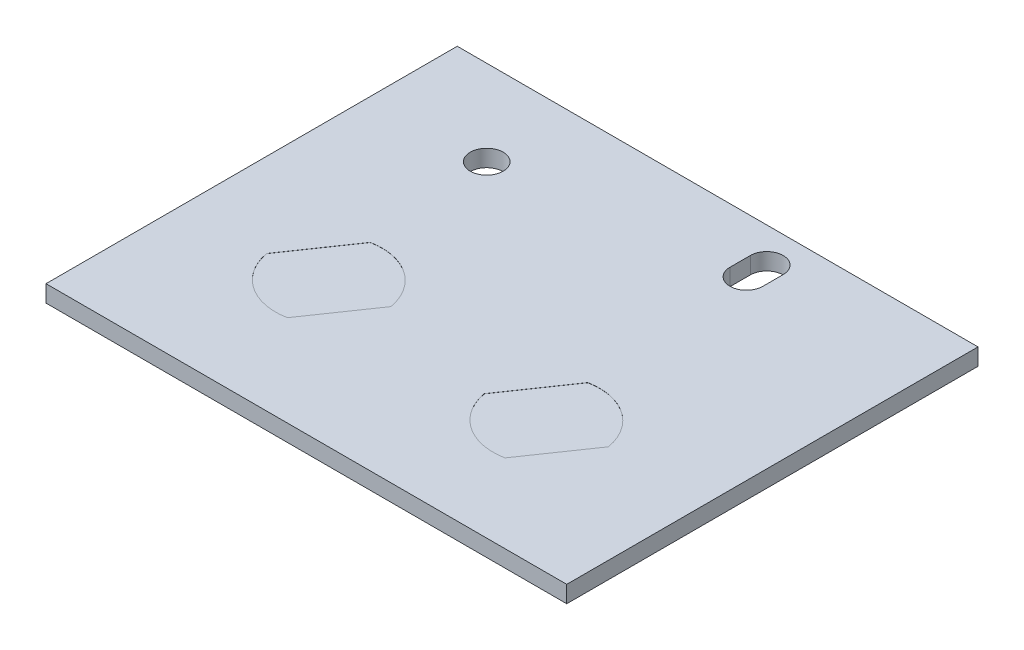
ISO-10303-21;
HEADER;
FILE_DESCRIPTION(('STEP AP214'),'2;1');
FILE_NAME('part.step','',(''),(''),'','','');
FILE_SCHEMA(('AUTOMOTIVE_DESIGN { 1 0 10303 214 1 1 1 1 }'));
ENDSEC;
DATA;
#1=APPLICATION_CONTEXT('core data for automotive mechanical design processes');
#2=APPLICATION_PROTOCOL_DEFINITION('international standard','automotive_design',2000,#1);
#3=PRODUCT_CONTEXT('',#1,'mechanical');
#4=PRODUCT('Part','Part','',(#3));
#5=PRODUCT_RELATED_PRODUCT_CATEGORY('part','',(#4));
#6=PRODUCT_DEFINITION_FORMATION('','',#4);
#7=PRODUCT_DEFINITION_CONTEXT('part definition',#1,'design');
#8=PRODUCT_DEFINITION('design','',#6,#7);
#9=PRODUCT_DEFINITION_SHAPE('','',#8);
#10=(LENGTH_UNIT() NAMED_UNIT(*) SI_UNIT(.MILLI.,.METRE.));
#11=(NAMED_UNIT(*) PLANE_ANGLE_UNIT() SI_UNIT($,.RADIAN.));
#12=(NAMED_UNIT(*) SI_UNIT($,.STERADIAN.) SOLID_ANGLE_UNIT());
#13=UNCERTAINTY_MEASURE_WITH_UNIT(LENGTH_MEASURE(1.E-05),#10,'distance_accuracy_value','');
#14=(GEOMETRIC_REPRESENTATION_CONTEXT(3) GLOBAL_UNCERTAINTY_ASSIGNED_CONTEXT((#13)) GLOBAL_UNIT_ASSIGNED_CONTEXT((#10,
#11,#12)) REPRESENTATION_CONTEXT('',''));
#15=CARTESIAN_POINT('',(0.,0.,0.));
#16=DIRECTION('',(0.,0.,1.));
#17=DIRECTION('',(1.,0.,0.));
#18=AXIS2_PLACEMENT_3D('',#15,#16,#17);
#19=CARTESIAN_POINT('',(0.,1.2,0.));
#20=DIRECTION('',(0.,-1.,0.));
#21=DIRECTION('',(0.,0.,-1.));
#22=AXIS2_PLACEMENT_3D('',#19,#20,#21);
#23=PLANE('',#22);
#24=DIRECTION('',(0.566037735849056,0.,-0.82437933113032));
#25=VECTOR('',#24,1.);
#26=CARTESIAN_POINT('',(-7.85103781255717,1.2,8.15000000000001));
#27=LINE('',#26,#25);
#28=CARTESIAN_POINT('',(-7.85103781255717,1.2,8.15000000000001));
#29=VERTEX_POINT('',#28);
#30=CARTESIAN_POINT('',(-4.85103781255718,1.2,3.78078954500931));
#31=VERTEX_POINT('',#30);
#32=EDGE_CURVE('E179',#29,#31,#27,.T.);
#33=ORIENTED_EDGE('',*,*,#32,.F.);
#34=CARTESIAN_POINT('',(-8.62445758552387,1.2,4.24141125271421));
#35=DIRECTION('',(0.,1.,0.));
#36=DIRECTION('',(0.,0.,1.));
#37=AXIS2_PLACEMENT_3D('',#34,#35,#36);
#38=CIRCLE('',#37,3.984375);
#39=CARTESIAN_POINT('',(-12.55,1.2,4.92358490566038));
#40=VERTEX_POINT('',#39);
#41=EDGE_CURVE('E52',#40,#29,#38,.T.);
#42=ORIENTED_EDGE('',*,*,#41,.F.);
#43=DIRECTION('',(-0.566037735849057,0.,0.82437933113032));
#44=VECTOR('',#43,1.);
#45=CARTESIAN_POINT('',(-12.55,1.2,4.92358490566038));
#46=LINE('',#45,#44);
#47=CARTESIAN_POINT('',(-9.55,1.2,0.554374450669691));
#48=VERTEX_POINT('',#47);
#49=EDGE_CURVE('E170',#48,#40,#46,.T.);
#50=ORIENTED_EDGE('',*,*,#49,.F.);
#51=CARTESIAN_POINT('',(-8.77658022703331,1.2,4.46296319795549));
#52=DIRECTION('',(0.,1.,0.));
#53=DIRECTION('',(0.,0.,-1.));
#54=AXIS2_PLACEMENT_3D('',#51,#52,#53);
#55=CIRCLE('',#54,3.984375);
#56=EDGE_CURVE('E173',#31,#48,#55,.T.);
#57=ORIENTED_EDGE('',*,*,#56,.F.);
#58=EDGE_LOOP('',(#33,#42,#50,#57));
#59=FACE_BOUND('',#58,.T.);
#60=DIRECTION('',(0.566037735849058,0.,-0.824379331130319));
#61=VECTOR('',#60,1.);
#62=CARTESIAN_POINT('',(8.55,1.2,9.0505244569));
#63=LINE('',#62,#61);
#64=CARTESIAN_POINT('',(8.55,1.2,9.0505244569));
#65=VERTEX_POINT('',#64);
#66=CARTESIAN_POINT('',(11.55,1.2,4.6813140019093));
#67=VERTEX_POINT('',#66);
#68=EDGE_CURVE('E205',#65,#67,#63,.T.);
#69=ORIENTED_EDGE('',*,*,#68,.F.);
#70=CARTESIAN_POINT('',(7.77658022703332,1.2,5.1419357096142));
#71=DIRECTION('',(0.,1.,0.));
#72=DIRECTION('',(0.,0.,1.));
#73=AXIS2_PLACEMENT_3D('',#70,#71,#72);
#74=CIRCLE('',#73,3.984375);
#75=CARTESIAN_POINT('',(3.85103781255718,1.2,5.82410936256038));
#76=VERTEX_POINT('',#75);
#77=EDGE_CURVE('E60',#76,#65,#74,.T.);
#78=ORIENTED_EDGE('',*,*,#77,.F.);
#79=DIRECTION('',(-0.566037735849056,0.,0.82437933113032));
#80=VECTOR('',#79,1.);
#81=CARTESIAN_POINT('',(3.85103781255718,1.2,5.82410936256038));
#82=LINE('',#81,#80);
#83=CARTESIAN_POINT('',(6.85103781255718,1.2,1.45489890756968));
#84=VERTEX_POINT('',#83);
#85=EDGE_CURVE('E194',#84,#76,#82,.T.);
#86=ORIENTED_EDGE('',*,*,#85,.F.);
#87=CARTESIAN_POINT('',(7.62445758552388,1.2,5.36348765485548));
#88=DIRECTION('',(0.,1.,0.));
#89=DIRECTION('',(0.,0.,-1.));
#90=AXIS2_PLACEMENT_3D('',#87,#88,#89);
#91=CIRCLE('',#90,3.984375);
#92=EDGE_CURVE('E208',#67,#84,#91,.T.);
#93=ORIENTED_EDGE('',*,*,#92,.F.);
#94=EDGE_LOOP('',(#69,#78,#86,#93));
#95=FACE_BOUND('',#94,.T.);
#96=DIRECTION('',(0.,0.,1.));
#97=VECTOR('',#96,1.);
#98=CARTESIAN_POINT('',(-18.55,1.2,14.65));
#99=LINE('',#98,#97);
#100=CARTESIAN_POINT('',(-18.55,1.2,-14.65));
#101=VERTEX_POINT('',#100);
#102=CARTESIAN_POINT('',(-18.55,1.2,14.65));
#103=VERTEX_POINT('',#102);
#104=EDGE_CURVE('E256',#101,#103,#99,.T.);
#105=ORIENTED_EDGE('',*,*,#104,.T.);
#106=DIRECTION('',(1.,0.,0.));
#107=VECTOR('',#106,1.);
#108=CARTESIAN_POINT('',(18.55,1.2,14.65));
#109=LINE('',#108,#107);
#110=CARTESIAN_POINT('',(18.55,1.2,14.65));
#111=VERTEX_POINT('',#110);
#112=EDGE_CURVE('E259',#103,#111,#109,.T.);
#113=ORIENTED_EDGE('',*,*,#112,.T.);
#114=DIRECTION('',(0.,0.,-1.));
#115=VECTOR('',#114,1.);
#116=CARTESIAN_POINT('',(18.55,1.2,-14.65));
#117=LINE('',#116,#115);
#118=CARTESIAN_POINT('',(18.55,1.2,-14.65));
#119=VERTEX_POINT('',#118);
#120=EDGE_CURVE('E262',#111,#119,#117,.T.);
#121=ORIENTED_EDGE('',*,*,#120,.T.);
#122=DIRECTION('',(-1.,0.,0.));
#123=VECTOR('',#122,1.);
#124=CARTESIAN_POINT('',(-18.55,1.2,-14.65));
#125=LINE('',#124,#123);
#126=EDGE_CURVE('E264',#119,#101,#125,.T.);
#127=ORIENTED_EDGE('',*,*,#126,.T.);
#128=EDGE_LOOP('',(#105,#113,#121,#127));
#129=FACE_BOUND('',#128,.T.);
#130=CARTESIAN_POINT('',(5.975,1.2,-12.175));
#131=DIRECTION('',(0.,1.,0.));
#132=DIRECTION('',(0.,0.,1.));
#133=AXIS2_PLACEMENT_3D('',#130,#131,#132);
#134=CIRCLE('',#133,1.175);
#135=CARTESIAN_POINT('',(7.15,1.2,-12.175));
#136=VERTEX_POINT('',#135);
#137=CARTESIAN_POINT('',(4.8,1.2,-12.175));
#138=VERTEX_POINT('',#137);
#139=EDGE_CURVE('E225',#136,#138,#134,.T.);
#140=ORIENTED_EDGE('',*,*,#139,.F.);
#141=DIRECTION('',(0.,0.,-1.));
#142=VECTOR('',#141,1.);
#143=CARTESIAN_POINT('',(7.15,1.2,-12.175));
#144=LINE('',#143,#142);
#145=CARTESIAN_POINT('',(7.15,1.2,-10.725));
#146=VERTEX_POINT('',#145);
#147=EDGE_CURVE('E233',#146,#136,#144,.T.);
#148=ORIENTED_EDGE('',*,*,#147,.F.);
#149=CARTESIAN_POINT('',(5.975,1.2,-10.725));
#150=DIRECTION('',(0.,1.,0.));
#151=DIRECTION('',(0.,0.,1.));
#152=AXIS2_PLACEMENT_3D('',#149,#150,#151);
#153=CIRCLE('',#152,1.175);
#154=CARTESIAN_POINT('',(4.8,1.2,-10.725));
#155=VERTEX_POINT('',#154);
#156=EDGE_CURVE('E230',#155,#146,#153,.T.);
#157=ORIENTED_EDGE('',*,*,#156,.F.);
#158=DIRECTION('',(0.,0.,1.));
#159=VECTOR('',#158,1.);
#160=CARTESIAN_POINT('',(4.8,1.2,-12.175));
#161=LINE('',#160,#159);
#162=EDGE_CURVE('E227',#138,#155,#161,.T.);
#163=ORIENTED_EDGE('',*,*,#162,.F.);
#164=EDGE_LOOP('',(#140,#148,#157,#163));
#165=FACE_BOUND('',#164,.T.);
#166=CARTESIAN_POINT('',(-10.375,1.2,-8.575));
#167=DIRECTION('',(0.,1.,0.));
#168=DIRECTION('',(0.,0.,1.));
#169=AXIS2_PLACEMENT_3D('',#166,#167,#168);
#170=CIRCLE('',#169,1.175);
#171=CARTESIAN_POINT('',(-10.375,1.2,-7.4));
#172=VERTEX_POINT('',#171);
#173=EDGE_CURVE('E219',#172,#172,#170,.T.);
#174=ORIENTED_EDGE('',*,*,#173,.F.);
#175=EDGE_LOOP('',(#174));
#176=FACE_BOUND('',#175,.T.);
#177=ADVANCED_FACE('F37',(#59,#95,#129,#165,#176),#23,.F.);
#178=CARTESIAN_POINT('',(0.,0.,0.));
#179=DIRECTION('',(0.,-1.,0.));
#180=DIRECTION('',(0.,0.,-1.));
#181=AXIS2_PLACEMENT_3D('',#178,#179,#180);
#182=PLANE('',#181);
#183=DIRECTION('',(0.,0.,-1.));
#184=VECTOR('',#183,1.);
#185=CARTESIAN_POINT('',(7.15,0.,-12.175));
#186=LINE('',#185,#184);
#187=CARTESIAN_POINT('',(7.15,0.,-10.725));
#188=VERTEX_POINT('',#187);
#189=CARTESIAN_POINT('',(7.15,0.,-12.175));
#190=VERTEX_POINT('',#189);
#191=EDGE_CURVE('E228',#188,#190,#186,.T.);
#192=ORIENTED_EDGE('',*,*,#191,.T.);
#193=CARTESIAN_POINT('',(5.975,0.,-12.175));
#194=DIRECTION('',(0.,1.,0.));
#195=DIRECTION('',(0.,0.,1.));
#196=AXIS2_PLACEMENT_3D('',#193,#194,#195);
#197=CIRCLE('',#196,1.175);
#198=CARTESIAN_POINT('',(4.8,0.,-12.175));
#199=VERTEX_POINT('',#198);
#200=EDGE_CURVE('E222',#190,#199,#197,.T.);
#201=ORIENTED_EDGE('',*,*,#200,.T.);
#202=DIRECTION('',(0.,0.,1.));
#203=VECTOR('',#202,1.);
#204=CARTESIAN_POINT('',(4.8,0.,-12.175));
#205=LINE('',#204,#203);
#206=CARTESIAN_POINT('',(4.8,0.,-10.725));
#207=VERTEX_POINT('',#206);
#208=EDGE_CURVE('E238',#199,#207,#205,.T.);
#209=ORIENTED_EDGE('',*,*,#208,.T.);
#210=CARTESIAN_POINT('',(5.975,0.,-10.725));
#211=DIRECTION('',(0.,1.,0.));
#212=DIRECTION('',(0.,0.,1.));
#213=AXIS2_PLACEMENT_3D('',#210,#211,#212);
#214=CIRCLE('',#213,1.175);
#215=EDGE_CURVE('E241',#207,#188,#214,.T.);
#216=ORIENTED_EDGE('',*,*,#215,.T.);
#217=EDGE_LOOP('',(#192,#201,#209,#216));
#218=FACE_BOUND('',#217,.T.);
#219=DIRECTION('',(0.,0.,1.));
#220=VECTOR('',#219,1.);
#221=CARTESIAN_POINT('',(-18.55,0.,14.65));
#222=LINE('',#221,#220);
#223=CARTESIAN_POINT('',(-18.55,0.,-14.65));
#224=VERTEX_POINT('',#223);
#225=CARTESIAN_POINT('',(-18.55,0.,14.65));
#226=VERTEX_POINT('',#225);
#227=EDGE_CURVE('E255',#224,#226,#222,.T.);
#228=ORIENTED_EDGE('',*,*,#227,.F.);
#229=DIRECTION('',(-1.,0.,0.));
#230=VECTOR('',#229,1.);
#231=CARTESIAN_POINT('',(-18.55,0.,-14.65));
#232=LINE('',#231,#230);
#233=CARTESIAN_POINT('',(18.55,0.,-14.65));
#234=VERTEX_POINT('',#233);
#235=EDGE_CURVE('E260',#234,#224,#232,.T.);
#236=ORIENTED_EDGE('',*,*,#235,.F.);
#237=DIRECTION('',(0.,0.,-1.));
#238=VECTOR('',#237,1.);
#239=CARTESIAN_POINT('',(18.55,0.,-14.65));
#240=LINE('',#239,#238);
#241=CARTESIAN_POINT('',(18.55,0.,14.65));
#242=VERTEX_POINT('',#241);
#243=EDGE_CURVE('E271',#242,#234,#240,.T.);
#244=ORIENTED_EDGE('',*,*,#243,.F.);
#245=DIRECTION('',(1.,0.,0.));
#246=VECTOR('',#245,1.);
#247=CARTESIAN_POINT('',(18.55,0.,14.65));
#248=LINE('',#247,#246);
#249=EDGE_CURVE('E269',#226,#242,#248,.T.);
#250=ORIENTED_EDGE('',*,*,#249,.F.);
#251=EDGE_LOOP('',(#228,#236,#244,#250));
#252=FACE_BOUND('',#251,.T.);
#253=CARTESIAN_POINT('',(-10.375,0.,-8.575));
#254=DIRECTION('',(0.,1.,0.));
#255=DIRECTION('',(0.,0.,1.));
#256=AXIS2_PLACEMENT_3D('',#253,#254,#255);
#257=CIRCLE('',#256,1.175);
#258=CARTESIAN_POINT('',(-10.375,0.,-7.4));
#259=VERTEX_POINT('',#258);
#260=EDGE_CURVE('E186',#259,#259,#257,.T.);
#261=ORIENTED_EDGE('',*,*,#260,.T.);
#262=EDGE_LOOP('',(#261));
#263=FACE_BOUND('',#262,.T.);
#264=ADVANCED_FACE('F289',(#218,#252,#263),#182,.T.);
#265=CARTESIAN_POINT('',(-18.55,1.2,14.65));
#266=DIRECTION('',(1.,0.,0.));
#267=DIRECTION('',(0.,0.,-1.));
#268=AXIS2_PLACEMENT_3D('',#265,#266,#267);
#269=PLANE('',#268);
#270=ORIENTED_EDGE('',*,*,#227,.T.);
#271=DIRECTION('',(0.,-1.,0.));
#272=VECTOR('',#271,1.);
#273=CARTESIAN_POINT('',(-18.55,1.2,14.65));
#274=LINE('',#273,#272);
#275=EDGE_CURVE('E11',#103,#226,#274,.T.);
#276=ORIENTED_EDGE('',*,*,#275,.F.);
#277=ORIENTED_EDGE('',*,*,#104,.F.);
#278=DIRECTION('',(0.,-1.,0.));
#279=VECTOR('',#278,1.);
#280=CARTESIAN_POINT('',(-18.55,1.2,-14.65));
#281=LINE('',#280,#279);
#282=EDGE_CURVE('E266',#101,#224,#281,.T.);
#283=ORIENTED_EDGE('',*,*,#282,.T.);
#284=EDGE_LOOP('',(#270,#276,#277,#283));
#285=FACE_BOUND('',#284,.T.);
#286=ADVANCED_FACE('F39',(#285),#269,.F.);
#287=CARTESIAN_POINT('',(18.55,1.2,14.65));
#288=DIRECTION('',(0.,0.,-1.));
#289=DIRECTION('',(-1.,0.,0.));
#290=AXIS2_PLACEMENT_3D('',#287,#288,#289);
#291=PLANE('',#290);
#292=ORIENTED_EDGE('',*,*,#249,.T.);
#293=DIRECTION('',(0.,-1.,0.));
#294=VECTOR('',#293,1.);
#295=CARTESIAN_POINT('',(18.55,1.2,14.65));
#296=LINE('',#295,#294);
#297=EDGE_CURVE('E45',#111,#242,#296,.T.);
#298=ORIENTED_EDGE('',*,*,#297,.F.);
#299=ORIENTED_EDGE('',*,*,#112,.F.);
#300=ORIENTED_EDGE('',*,*,#275,.T.);
#301=EDGE_LOOP('',(#292,#298,#299,#300));
#302=FACE_BOUND('',#301,.T.);
#303=ADVANCED_FACE('F300',(#302),#291,.F.);
#304=CARTESIAN_POINT('',(18.55,1.2,-14.65));
#305=DIRECTION('',(-1.,0.,0.));
#306=DIRECTION('',(0.,0.,1.));
#307=AXIS2_PLACEMENT_3D('',#304,#305,#306);
#308=PLANE('',#307);
#309=ORIENTED_EDGE('',*,*,#243,.T.);
#310=DIRECTION('',(0.,-1.,0.));
#311=VECTOR('',#310,1.);
#312=CARTESIAN_POINT('',(18.55,1.2,-14.65));
#313=LINE('',#312,#311);
#314=EDGE_CURVE('E276',#119,#234,#313,.T.);
#315=ORIENTED_EDGE('',*,*,#314,.F.);
#316=ORIENTED_EDGE('',*,*,#120,.F.);
#317=ORIENTED_EDGE('',*,*,#297,.T.);
#318=EDGE_LOOP('',(#309,#315,#316,#317));
#319=FACE_BOUND('',#318,.T.);
#320=ADVANCED_FACE('F283',(#319),#308,.F.);
#321=CARTESIAN_POINT('',(-18.55,1.2,-14.65));
#322=DIRECTION('',(0.,0.,1.));
#323=DIRECTION('',(1.,0.,0.));
#324=AXIS2_PLACEMENT_3D('',#321,#322,#323);
#325=PLANE('',#324);
#326=ORIENTED_EDGE('',*,*,#235,.T.);
#327=ORIENTED_EDGE('',*,*,#282,.F.);
#328=ORIENTED_EDGE('',*,*,#126,.F.);
#329=ORIENTED_EDGE('',*,*,#314,.T.);
#330=EDGE_LOOP('',(#326,#327,#328,#329));
#331=FACE_BOUND('',#330,.T.);
#332=ADVANCED_FACE('F293',(#331),#325,.F.);
#333=CARTESIAN_POINT('',(5.975,1.2,-12.175));
#334=DIRECTION('',(0.,-1.,0.));
#335=DIRECTION('',(0.,0.,-1.));
#336=AXIS2_PLACEMENT_3D('',#333,#334,#335);
#337=CYLINDRICAL_SURFACE('',#336,1.175);
#338=ORIENTED_EDGE('',*,*,#200,.F.);
#339=DIRECTION('',(0.,-1.,0.));
#340=VECTOR('',#339,1.);
#341=CARTESIAN_POINT('',(7.15,1.2,-12.175));
#342=LINE('',#341,#340);
#343=EDGE_CURVE('E235',#136,#190,#342,.T.);
#344=ORIENTED_EDGE('',*,*,#343,.F.);
#345=ORIENTED_EDGE('',*,*,#139,.T.);
#346=DIRECTION('',(0.,-1.,0.));
#347=VECTOR('',#346,1.);
#348=CARTESIAN_POINT('',(4.8,1.2,-12.175));
#349=LINE('',#348,#347);
#350=EDGE_CURVE('E252',#138,#199,#349,.T.);
#351=ORIENTED_EDGE('',*,*,#350,.T.);
#352=EDGE_LOOP('',(#338,#344,#345,#351));
#353=FACE_BOUND('',#352,.T.);
#354=ADVANCED_FACE('F317',(#353),#337,.F.);
#355=CARTESIAN_POINT('',(4.8,1.2,-12.175));
#356=DIRECTION('',(1.,0.,0.));
#357=DIRECTION('',(0.,0.,-1.));
#358=AXIS2_PLACEMENT_3D('',#355,#356,#357);
#359=PLANE('',#358);
#360=ORIENTED_EDGE('',*,*,#208,.F.);
#361=ORIENTED_EDGE('',*,*,#350,.F.);
#362=ORIENTED_EDGE('',*,*,#162,.T.);
#363=DIRECTION('',(0.,-1.,0.));
#364=VECTOR('',#363,1.);
#365=CARTESIAN_POINT('',(4.8,1.2,-10.725));
#366=LINE('',#365,#364);
#367=EDGE_CURVE('E250',#155,#207,#366,.T.);
#368=ORIENTED_EDGE('',*,*,#367,.T.);
#369=EDGE_LOOP('',(#360,#361,#362,#368));
#370=FACE_BOUND('',#369,.T.);
#371=ADVANCED_FACE('F324',(#370),#359,.T.);
#372=CARTESIAN_POINT('',(5.975,1.2,-10.725));
#373=DIRECTION('',(0.,-1.,0.));
#374=DIRECTION('',(0.,0.,-1.));
#375=AXIS2_PLACEMENT_3D('',#372,#373,#374);
#376=CYLINDRICAL_SURFACE('',#375,1.175);
#377=ORIENTED_EDGE('',*,*,#215,.F.);
#378=ORIENTED_EDGE('',*,*,#367,.F.);
#379=ORIENTED_EDGE('',*,*,#156,.T.);
#380=DIRECTION('',(0.,-1.,0.));
#381=VECTOR('',#380,1.);
#382=CARTESIAN_POINT('',(7.15,1.2,-10.725));
#383=LINE('',#382,#381);
#384=EDGE_CURVE('E248',#146,#188,#383,.T.);
#385=ORIENTED_EDGE('',*,*,#384,.T.);
#386=EDGE_LOOP('',(#377,#378,#379,#385));
#387=FACE_BOUND('',#386,.T.);
#388=ADVANCED_FACE('F329',(#387),#376,.F.);
#389=CARTESIAN_POINT('',(7.15,1.2,-12.175));
#390=DIRECTION('',(-1.,0.,0.));
#391=DIRECTION('',(0.,0.,1.));
#392=AXIS2_PLACEMENT_3D('',#389,#390,#391);
#393=PLANE('',#392);
#394=ORIENTED_EDGE('',*,*,#191,.F.);
#395=ORIENTED_EDGE('',*,*,#384,.F.);
#396=ORIENTED_EDGE('',*,*,#147,.T.);
#397=ORIENTED_EDGE('',*,*,#343,.T.);
#398=EDGE_LOOP('',(#394,#395,#396,#397));
#399=FACE_BOUND('',#398,.T.);
#400=ADVANCED_FACE('F336',(#399),#393,.T.);
#401=CARTESIAN_POINT('',(-10.375,1.2,-8.575));
#402=DIRECTION('',(0.,-1.,0.));
#403=DIRECTION('',(0.,0.,-1.));
#404=AXIS2_PLACEMENT_3D('',#401,#402,#403);
#405=CYLINDRICAL_SURFACE('',#404,1.175);
#406=ORIENTED_EDGE('',*,*,#173,.T.);
#407=EDGE_LOOP('',(#406));
#408=FACE_BOUND('',#407,.T.);
#409=ORIENTED_EDGE('',*,*,#260,.F.);
#410=EDGE_LOOP('',(#409));
#411=FACE_BOUND('',#410,.T.);
#412=ADVANCED_FACE('F346',(#408,#411),#405,.F.);
#413=CARTESIAN_POINT('',(7.77658022703332,1.19,5.1419357096142));
#414=DIRECTION('',(0.,1.,0.));
#415=DIRECTION('',(0.,0.,1.));
#416=AXIS2_PLACEMENT_3D('',#413,#414,#415);
#417=CYLINDRICAL_SURFACE('',#416,3.984375);
#418=ORIENTED_EDGE('',*,*,#77,.T.);
#419=DIRECTION('',(0.,1.,0.));
#420=VECTOR('',#419,1.);
#421=CARTESIAN_POINT('',(8.55,1.19,9.0505244569));
#422=LINE('',#421,#420);
#423=CARTESIAN_POINT('',(8.55,1.19,9.0505244569));
#424=VERTEX_POINT('',#423);
#425=EDGE_CURVE('E203',#424,#65,#422,.T.);
#426=ORIENTED_EDGE('',*,*,#425,.F.);
#427=CARTESIAN_POINT('',(7.77658022703332,1.19,5.1419357096142));
#428=DIRECTION('',(0.,1.,0.));
#429=DIRECTION('',(0.,0.,1.));
#430=AXIS2_PLACEMENT_3D('',#427,#428,#429);
#431=CIRCLE('',#430,3.984375);
#432=CARTESIAN_POINT('',(3.85103781255718,1.19,5.82410936256038));
#433=VERTEX_POINT('',#432);
#434=EDGE_CURVE('E190',#433,#424,#431,.T.);
#435=ORIENTED_EDGE('',*,*,#434,.F.);
#436=DIRECTION('',(0.,1.,0.));
#437=VECTOR('',#436,1.);
#438=CARTESIAN_POINT('',(3.85103781255718,1.19,5.82410936256038));
#439=LINE('',#438,#437);
#440=EDGE_CURVE('E180',#433,#76,#439,.T.);
#441=ORIENTED_EDGE('',*,*,#440,.T.);
#442=EDGE_LOOP('',(#418,#426,#435,#441));
#443=FACE_BOUND('',#442,.T.);
#444=ADVANCED_FACE('F349',(#443),#417,.F.);
#445=CARTESIAN_POINT('',(3.85103781255718,1.19,5.82410936256038));
#446=DIRECTION('',(-0.82437933113032,0.,-0.566037735849056));
#447=DIRECTION('',(-0.566037735849056,0.,0.82437933113032));
#448=AXIS2_PLACEMENT_3D('',#445,#446,#447);
#449=PLANE('',#448);
#450=ORIENTED_EDGE('',*,*,#85,.T.);
#451=ORIENTED_EDGE('',*,*,#440,.F.);
#452=DIRECTION('',(-0.566037735849056,0.,0.82437933113032));
#453=VECTOR('',#452,1.);
#454=CARTESIAN_POINT('',(3.85103781255718,1.19,5.82410936256038));
#455=LINE('',#454,#453);
#456=CARTESIAN_POINT('',(6.85103781255718,1.19,1.45489890756968));
#457=VERTEX_POINT('',#456);
#458=EDGE_CURVE('E200',#457,#433,#455,.T.);
#459=ORIENTED_EDGE('',*,*,#458,.F.);
#460=DIRECTION('',(0.,1.,0.));
#461=VECTOR('',#460,1.);
#462=CARTESIAN_POINT('',(6.85103781255718,1.19,1.45489890756968));
#463=LINE('',#462,#461);
#464=EDGE_CURVE('E214',#457,#84,#463,.T.);
#465=ORIENTED_EDGE('',*,*,#464,.T.);
#466=EDGE_LOOP('',(#450,#451,#459,#465));
#467=FACE_BOUND('',#466,.T.);
#468=ADVANCED_FACE('F356',(#467),#449,.F.);
#469=CARTESIAN_POINT('',(7.62445758552388,1.19,5.36348765485548));
#470=DIRECTION('',(0.,1.,0.));
#471=DIRECTION('',(0.,0.,1.));
#472=AXIS2_PLACEMENT_3D('',#469,#470,#471);
#473=CYLINDRICAL_SURFACE('',#472,3.984375);
#474=ORIENTED_EDGE('',*,*,#92,.T.);
#475=ORIENTED_EDGE('',*,*,#464,.F.);
#476=CARTESIAN_POINT('',(7.62445758552388,1.19,5.36348765485548));
#477=DIRECTION('',(0.,1.,0.));
#478=DIRECTION('',(0.,0.,-1.));
#479=AXIS2_PLACEMENT_3D('',#476,#477,#478);
#480=CIRCLE('',#479,3.984375);
#481=CARTESIAN_POINT('',(11.55,1.19,4.6813140019093));
#482=VERTEX_POINT('',#481);
#483=EDGE_CURVE('E197',#482,#457,#480,.T.);
#484=ORIENTED_EDGE('',*,*,#483,.F.);
#485=DIRECTION('',(0.,1.,0.));
#486=VECTOR('',#485,1.);
#487=CARTESIAN_POINT('',(11.55,1.19,4.6813140019093));
#488=LINE('',#487,#486);
#489=EDGE_CURVE('E216',#482,#67,#488,.T.);
#490=ORIENTED_EDGE('',*,*,#489,.T.);
#491=EDGE_LOOP('',(#474,#475,#484,#490));
#492=FACE_BOUND('',#491,.T.);
#493=ADVANCED_FACE('F394',(#492),#473,.F.);
#494=CARTESIAN_POINT('',(8.55,1.19,9.0505244569));
#495=DIRECTION('',(0.824379331130319,0.,0.566037735849058));
#496=DIRECTION('',(0.566037735849058,0.,-0.824379331130319));
#497=AXIS2_PLACEMENT_3D('',#494,#495,#496);
#498=PLANE('',#497);
#499=ORIENTED_EDGE('',*,*,#68,.T.);
#500=ORIENTED_EDGE('',*,*,#489,.F.);
#501=DIRECTION('',(0.566037735849058,0.,-0.824379331130319));
#502=VECTOR('',#501,1.);
#503=CARTESIAN_POINT('',(8.55,1.19,9.0505244569));
#504=LINE('',#503,#502);
#505=EDGE_CURVE('E193',#424,#482,#504,.T.);
#506=ORIENTED_EDGE('',*,*,#505,.F.);
#507=ORIENTED_EDGE('',*,*,#425,.T.);
#508=EDGE_LOOP('',(#499,#500,#506,#507));
#509=FACE_BOUND('',#508,.T.);
#510=ADVANCED_FACE('F404',(#509),#498,.F.);
#511=CARTESIAN_POINT('',(7.77658022703332,1.19,5.1419357096142));
#512=DIRECTION('',(0.,1.,0.));
#513=DIRECTION('',(0.,0.,1.));
#514=AXIS2_PLACEMENT_3D('',#511,#512,#513);
#515=PLANE('',#514);
#516=ORIENTED_EDGE('',*,*,#434,.T.);
#517=ORIENTED_EDGE('',*,*,#505,.T.);
#518=ORIENTED_EDGE('',*,*,#483,.T.);
#519=ORIENTED_EDGE('',*,*,#458,.T.);
#520=EDGE_LOOP('',(#516,#517,#518,#519));
#521=FACE_BOUND('',#520,.T.);
#522=ADVANCED_FACE('F414',(#521),#515,.T.);
#523=CARTESIAN_POINT('',(-8.62445758552387,1.19,4.24141125271421));
#524=DIRECTION('',(0.,1.,0.));
#525=DIRECTION('',(0.,0.,1.));
#526=AXIS2_PLACEMENT_3D('',#523,#524,#525);
#527=CYLINDRICAL_SURFACE('',#526,3.984375);
#528=ORIENTED_EDGE('',*,*,#41,.T.);
#529=DIRECTION('',(0.,1.,0.));
#530=VECTOR('',#529,1.);
#531=CARTESIAN_POINT('',(-7.85103781255717,1.19,8.15000000000001));
#532=LINE('',#531,#530);
#533=CARTESIAN_POINT('',(-7.85103781255717,1.19,8.15000000000001));
#534=VERTEX_POINT('',#533);
#535=EDGE_CURVE('E148',#534,#29,#532,.T.);
#536=ORIENTED_EDGE('',*,*,#535,.F.);
#537=CARTESIAN_POINT('',(-8.62445758552387,1.19,4.24141125271421));
#538=DIRECTION('',(0.,1.,0.));
#539=DIRECTION('',(0.,0.,1.));
#540=AXIS2_PLACEMENT_3D('',#537,#538,#539);
#541=CIRCLE('',#540,3.984375);
#542=CARTESIAN_POINT('',(-12.55,1.19,4.92358490566038));
#543=VERTEX_POINT('',#542);
#544=EDGE_CURVE('E152',#543,#534,#541,.T.);
#545=ORIENTED_EDGE('',*,*,#544,.F.);
#546=DIRECTION('',(0.,1.,0.));
#547=VECTOR('',#546,1.);
#548=CARTESIAN_POINT('',(-12.55,1.19,4.92358490566038));
#549=LINE('',#548,#547);
#550=EDGE_CURVE('E184',#543,#40,#549,.T.);
#551=ORIENTED_EDGE('',*,*,#550,.T.);
#552=EDGE_LOOP('',(#528,#536,#545,#551));
#553=FACE_BOUND('',#552,.T.);
#554=ADVANCED_FACE('F150',(#553),#527,.F.);
#555=CARTESIAN_POINT('',(-12.55,1.19,4.92358490566038));
#556=DIRECTION('',(-0.82437933113032,0.,-0.566037735849057));
#557=DIRECTION('',(-0.566037735849057,0.,0.82437933113032));
#558=AXIS2_PLACEMENT_3D('',#555,#556,#557);
#559=PLANE('',#558);
#560=ORIENTED_EDGE('',*,*,#49,.T.);
#561=ORIENTED_EDGE('',*,*,#550,.F.);
#562=DIRECTION('',(-0.566037735849057,0.,0.82437933113032));
#563=VECTOR('',#562,1.);
#564=CARTESIAN_POINT('',(-12.55,1.19,4.92358490566038));
#565=LINE('',#564,#563);
#566=CARTESIAN_POINT('',(-9.55,1.19,0.554374450669691));
#567=VERTEX_POINT('',#566);
#568=EDGE_CURVE('E158',#567,#543,#565,.T.);
#569=ORIENTED_EDGE('',*,*,#568,.F.);
#570=DIRECTION('',(0.,1.,0.));
#571=VECTOR('',#570,1.);
#572=CARTESIAN_POINT('',(-9.55,1.19,0.554374450669691));
#573=LINE('',#572,#571);
#574=EDGE_CURVE('E187',#567,#48,#573,.T.);
#575=ORIENTED_EDGE('',*,*,#574,.T.);
#576=EDGE_LOOP('',(#560,#561,#569,#575));
#577=FACE_BOUND('',#576,.T.);
#578=ADVANCED_FACE('F432',(#577),#559,.F.);
#579=CARTESIAN_POINT('',(-8.77658022703331,1.19,4.46296319795549));
#580=DIRECTION('',(0.,1.,0.));
#581=DIRECTION('',(0.,0.,1.));
#582=AXIS2_PLACEMENT_3D('',#579,#580,#581);
#583=CYLINDRICAL_SURFACE('',#582,3.984375);
#584=ORIENTED_EDGE('',*,*,#56,.T.);
#585=ORIENTED_EDGE('',*,*,#574,.F.);
#586=CARTESIAN_POINT('',(-8.77658022703331,1.19,4.46296319795549));
#587=DIRECTION('',(0.,1.,0.));
#588=DIRECTION('',(0.,0.,-1.));
#589=AXIS2_PLACEMENT_3D('',#586,#587,#588);
#590=CIRCLE('',#589,3.984375);
#591=CARTESIAN_POINT('',(-4.85103781255718,1.19,3.78078954500931));
#592=VERTEX_POINT('',#591);
#593=EDGE_CURVE('E166',#592,#567,#590,.T.);
#594=ORIENTED_EDGE('',*,*,#593,.F.);
#595=DIRECTION('',(0.,1.,0.));
#596=VECTOR('',#595,1.);
#597=CARTESIAN_POINT('',(-4.85103781255718,1.19,3.78078954500931));
#598=LINE('',#597,#596);
#599=EDGE_CURVE('E157',#592,#31,#598,.T.);
#600=ORIENTED_EDGE('',*,*,#599,.T.);
#601=EDGE_LOOP('',(#584,#585,#594,#600));
#602=FACE_BOUND('',#601,.T.);
#603=ADVANCED_FACE('F441',(#602),#583,.F.);
#604=CARTESIAN_POINT('',(-7.85103781255717,1.19,8.15000000000001));
#605=DIRECTION('',(0.82437933113032,0.,0.566037735849056));
#606=DIRECTION('',(0.566037735849056,0.,-0.82437933113032));
#607=AXIS2_PLACEMENT_3D('',#604,#605,#606);
#608=PLANE('',#607);
#609=ORIENTED_EDGE('',*,*,#32,.T.);
#610=ORIENTED_EDGE('',*,*,#599,.F.);
#611=DIRECTION('',(0.566037735849056,0.,-0.82437933113032));
#612=VECTOR('',#611,1.);
#613=CARTESIAN_POINT('',(-7.85103781255717,1.19,8.15000000000001));
#614=LINE('',#613,#612);
#615=EDGE_CURVE('E161',#534,#592,#614,.T.);
#616=ORIENTED_EDGE('',*,*,#615,.F.);
#617=ORIENTED_EDGE('',*,*,#535,.T.);
#618=EDGE_LOOP('',(#609,#610,#616,#617));
#619=FACE_BOUND('',#618,.T.);
#620=ADVANCED_FACE('F162',(#619),#608,.F.);
#621=CARTESIAN_POINT('',(-8.62445758552387,1.19,4.24141125271421));
#622=DIRECTION('',(0.,1.,0.));
#623=DIRECTION('',(0.,0.,1.));
#624=AXIS2_PLACEMENT_3D('',#621,#622,#623);
#625=PLANE('',#624);
#626=ORIENTED_EDGE('',*,*,#544,.T.);
#627=ORIENTED_EDGE('',*,*,#615,.T.);
#628=ORIENTED_EDGE('',*,*,#593,.T.);
#629=ORIENTED_EDGE('',*,*,#568,.T.);
#630=EDGE_LOOP('',(#626,#627,#628,#629));
#631=FACE_BOUND('',#630,.T.);
#632=ADVANCED_FACE('F168',(#631),#625,.T.);
#633=CLOSED_SHELL('',(#177,#264,#286,#303,#320,#332,#354,#371,#388,#400,#412,#444,#468,#493,
#510,#522,#554,#578,#603,#620,#632));
#634=MANIFOLD_SOLID_BREP('B2',#633);
#635=ADVANCED_BREP_SHAPE_REPRESENTATION('',(#18,#634),#14);
#636=SHAPE_DEFINITION_REPRESENTATION(#9,#635);
ENDSEC;
END-ISO-10303-21;
